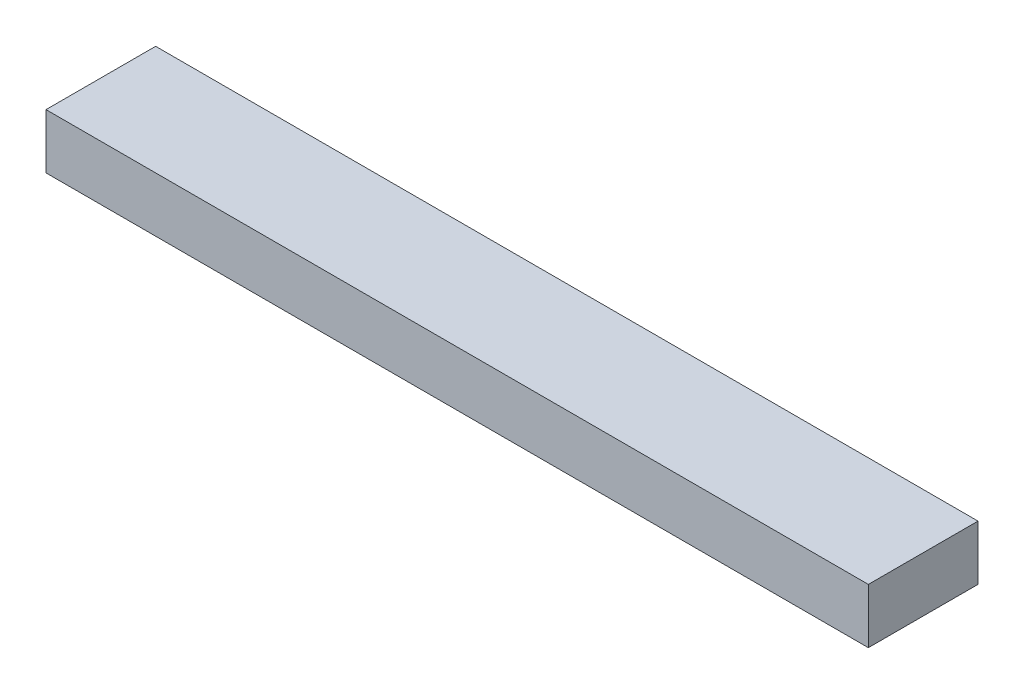
ISO-10303-21;
HEADER;
FILE_DESCRIPTION(('STEP AP214'),'2;1');
FILE_NAME('part.step','',(''),(''),'','','');
FILE_SCHEMA(('AUTOMOTIVE_DESIGN { 1 0 10303 214 1 1 1 1 }'));
ENDSEC;
DATA;
#1=APPLICATION_CONTEXT('core data for automotive mechanical design processes');
#2=APPLICATION_PROTOCOL_DEFINITION('international standard','automotive_design',2000,#1);
#3=PRODUCT_CONTEXT('',#1,'mechanical');
#4=PRODUCT('Part','Part','',(#3));
#5=PRODUCT_RELATED_PRODUCT_CATEGORY('part','',(#4));
#6=PRODUCT_DEFINITION_FORMATION('','',#4);
#7=PRODUCT_DEFINITION_CONTEXT('part definition',#1,'design');
#8=PRODUCT_DEFINITION('design','',#6,#7);
#9=PRODUCT_DEFINITION_SHAPE('','',#8);
#10=(LENGTH_UNIT() NAMED_UNIT(*) SI_UNIT(.MILLI.,.METRE.));
#11=(NAMED_UNIT(*) PLANE_ANGLE_UNIT() SI_UNIT($,.RADIAN.));
#12=(NAMED_UNIT(*) SI_UNIT($,.STERADIAN.) SOLID_ANGLE_UNIT());
#13=UNCERTAINTY_MEASURE_WITH_UNIT(LENGTH_MEASURE(1.E-05),#10,'distance_accuracy_value','');
#14=(GEOMETRIC_REPRESENTATION_CONTEXT(3) GLOBAL_UNCERTAINTY_ASSIGNED_CONTEXT((#13)) GLOBAL_UNIT_ASSIGNED_CONTEXT((#10,
#11,#12)) REPRESENTATION_CONTEXT('',''));
#15=CARTESIAN_POINT('',(0.,0.,0.));
#16=DIRECTION('',(0.,0.,1.));
#17=DIRECTION('',(1.,0.,0.));
#18=AXIS2_PLACEMENT_3D('',#15,#16,#17);
#19=CARTESIAN_POINT('',(75.,10.,10.));
#20=DIRECTION('',(-1.,0.,0.));
#21=DIRECTION('',(0.,0.,1.));
#22=AXIS2_PLACEMENT_3D('',#19,#20,#21);
#23=PLANE('',#22);
#24=DIRECTION('',(0.,0.,-1.));
#25=VECTOR('',#24,1.);
#26=CARTESIAN_POINT('',(75.,0.,10.));
#27=LINE('',#26,#25);
#28=CARTESIAN_POINT('',(75.,0.,10.));
#29=VERTEX_POINT('',#28);
#30=CARTESIAN_POINT('',(75.,0.,-10.));
#31=VERTEX_POINT('',#30);
#32=EDGE_CURVE('E111',#29,#31,#27,.T.);
#33=ORIENTED_EDGE('',*,*,#32,.T.);
#34=DIRECTION('',(0.,-1.,0.));
#35=VECTOR('',#34,1.);
#36=CARTESIAN_POINT('',(75.,10.,-10.));
#37=LINE('',#36,#35);
#38=CARTESIAN_POINT('',(75.,10.,-10.));
#39=VERTEX_POINT('',#38);
#40=EDGE_CURVE('E11',#39,#31,#37,.T.);
#41=ORIENTED_EDGE('',*,*,#40,.F.);
#42=DIRECTION('',(0.,0.,-1.));
#43=VECTOR('',#42,1.);
#44=CARTESIAN_POINT('',(75.,10.,10.));
#45=LINE('',#44,#43);
#46=CARTESIAN_POINT('',(75.,10.,10.));
#47=VERTEX_POINT('',#46);
#48=EDGE_CURVE('E95',#47,#39,#45,.T.);
#49=ORIENTED_EDGE('',*,*,#48,.F.);
#50=DIRECTION('',(0.,-1.,0.));
#51=VECTOR('',#50,1.);
#52=CARTESIAN_POINT('',(75.,10.,10.));
#53=LINE('',#52,#51);
#54=EDGE_CURVE('E107',#47,#29,#53,.T.);
#55=ORIENTED_EDGE('',*,*,#54,.T.);
#56=EDGE_LOOP('',(#33,#41,#49,#55));
#57=FACE_BOUND('',#56,.T.);
#58=ADVANCED_FACE('F43',(#57),#23,.F.);
#59=CARTESIAN_POINT('',(-75.,10.,-10.));
#60=DIRECTION('',(0.,0.,1.));
#61=DIRECTION('',(1.,0.,0.));
#62=AXIS2_PLACEMENT_3D('',#59,#60,#61);
#63=PLANE('',#62);
#64=DIRECTION('',(-1.,0.,0.));
#65=VECTOR('',#64,1.);
#66=CARTESIAN_POINT('',(-75.,0.,-10.));
#67=LINE('',#66,#65);
#68=CARTESIAN_POINT('',(-75.,0.,-10.));
#69=VERTEX_POINT('',#68);
#70=EDGE_CURVE('E100',#31,#69,#67,.T.);
#71=ORIENTED_EDGE('',*,*,#70,.T.);
#72=DIRECTION('',(0.,-1.,0.));
#73=VECTOR('',#72,1.);
#74=CARTESIAN_POINT('',(-75.,10.,-10.));
#75=LINE('',#74,#73);
#76=CARTESIAN_POINT('',(-75.,10.,-10.));
#77=VERTEX_POINT('',#76);
#78=EDGE_CURVE('E52',#77,#69,#75,.T.);
#79=ORIENTED_EDGE('',*,*,#78,.F.);
#80=DIRECTION('',(-1.,0.,0.));
#81=VECTOR('',#80,1.);
#82=CARTESIAN_POINT('',(-75.,10.,-10.));
#83=LINE('',#82,#81);
#84=EDGE_CURVE('E90',#39,#77,#83,.T.);
#85=ORIENTED_EDGE('',*,*,#84,.F.);
#86=ORIENTED_EDGE('',*,*,#40,.T.);
#87=EDGE_LOOP('',(#71,#79,#85,#86));
#88=FACE_BOUND('',#87,.T.);
#89=ADVANCED_FACE('F99',(#88),#63,.F.);
#90=CARTESIAN_POINT('',(-75.,10.,10.));
#91=DIRECTION('',(1.,0.,0.));
#92=DIRECTION('',(0.,0.,-1.));
#93=AXIS2_PLACEMENT_3D('',#90,#91,#92);
#94=PLANE('',#93);
#95=DIRECTION('',(0.,0.,1.));
#96=VECTOR('',#95,1.);
#97=CARTESIAN_POINT('',(-75.,0.,10.));
#98=LINE('',#97,#96);
#99=CARTESIAN_POINT('',(-75.,0.,10.));
#100=VERTEX_POINT('',#99);
#101=EDGE_CURVE('E77',#69,#100,#98,.T.);
#102=ORIENTED_EDGE('',*,*,#101,.T.);
#103=DIRECTION('',(0.,-1.,0.));
#104=VECTOR('',#103,1.);
#105=CARTESIAN_POINT('',(-75.,10.,10.));
#106=LINE('',#105,#104);
#107=CARTESIAN_POINT('',(-75.,10.,10.));
#108=VERTEX_POINT('',#107);
#109=EDGE_CURVE('E102',#108,#100,#106,.T.);
#110=ORIENTED_EDGE('',*,*,#109,.F.);
#111=DIRECTION('',(0.,0.,1.));
#112=VECTOR('',#111,1.);
#113=CARTESIAN_POINT('',(-75.,10.,10.));
#114=LINE('',#113,#112);
#115=EDGE_CURVE('E93',#77,#108,#114,.T.);
#116=ORIENTED_EDGE('',*,*,#115,.F.);
#117=ORIENTED_EDGE('',*,*,#78,.T.);
#118=EDGE_LOOP('',(#102,#110,#116,#117));
#119=FACE_BOUND('',#118,.T.);
#120=ADVANCED_FACE('F103',(#119),#94,.F.);
#121=CARTESIAN_POINT('',(-75.,10.,10.));
#122=DIRECTION('',(0.,0.,-1.));
#123=DIRECTION('',(-1.,0.,0.));
#124=AXIS2_PLACEMENT_3D('',#121,#122,#123);
#125=PLANE('',#124);
#126=DIRECTION('',(1.,0.,0.));
#127=VECTOR('',#126,1.);
#128=CARTESIAN_POINT('',(-75.,0.,10.));
#129=LINE('',#128,#127);
#130=EDGE_CURVE('E83',#100,#29,#129,.T.);
#131=ORIENTED_EDGE('',*,*,#130,.T.);
#132=ORIENTED_EDGE('',*,*,#54,.F.);
#133=DIRECTION('',(1.,0.,0.));
#134=VECTOR('',#133,1.);
#135=CARTESIAN_POINT('',(-75.,10.,10.));
#136=LINE('',#135,#134);
#137=EDGE_CURVE('E60',#108,#47,#136,.T.);
#138=ORIENTED_EDGE('',*,*,#137,.F.);
#139=ORIENTED_EDGE('',*,*,#109,.T.);
#140=EDGE_LOOP('',(#131,#132,#138,#139));
#141=FACE_BOUND('',#140,.T.);
#142=ADVANCED_FACE('F124',(#141),#125,.F.);
#143=CARTESIAN_POINT('',(0.,10.,0.));
#144=DIRECTION('',(0.,-1.,0.));
#145=DIRECTION('',(0.,0.,-1.));
#146=AXIS2_PLACEMENT_3D('',#143,#144,#145);
#147=PLANE('',#146);
#148=ORIENTED_EDGE('',*,*,#48,.T.);
#149=ORIENTED_EDGE('',*,*,#84,.T.);
#150=ORIENTED_EDGE('',*,*,#115,.T.);
#151=ORIENTED_EDGE('',*,*,#137,.T.);
#152=EDGE_LOOP('',(#148,#149,#150,#151));
#153=FACE_BOUND('',#152,.T.);
#154=ADVANCED_FACE('F91',(#153),#147,.F.);
#155=CARTESIAN_POINT('',(0.,0.,0.));
#156=DIRECTION('',(0.,-1.,0.));
#157=DIRECTION('',(0.,0.,-1.));
#158=AXIS2_PLACEMENT_3D('',#155,#156,#157);
#159=PLANE('',#158);
#160=ORIENTED_EDGE('',*,*,#32,.F.);
#161=ORIENTED_EDGE('',*,*,#130,.F.);
#162=ORIENTED_EDGE('',*,*,#101,.F.);
#163=ORIENTED_EDGE('',*,*,#70,.F.);
#164=EDGE_LOOP('',(#160,#161,#162,#163));
#165=FACE_BOUND('',#164,.T.);
#166=ADVANCED_FACE('F127',(#165),#159,.T.);
#167=CLOSED_SHELL('',(#58,#89,#120,#142,#154,#166));
#168=MANIFOLD_SOLID_BREP('B2',#167);
#169=ADVANCED_BREP_SHAPE_REPRESENTATION('',(#18,#168),#14);
#170=SHAPE_DEFINITION_REPRESENTATION(#9,#169);
ENDSEC;
END-ISO-10303-21;
